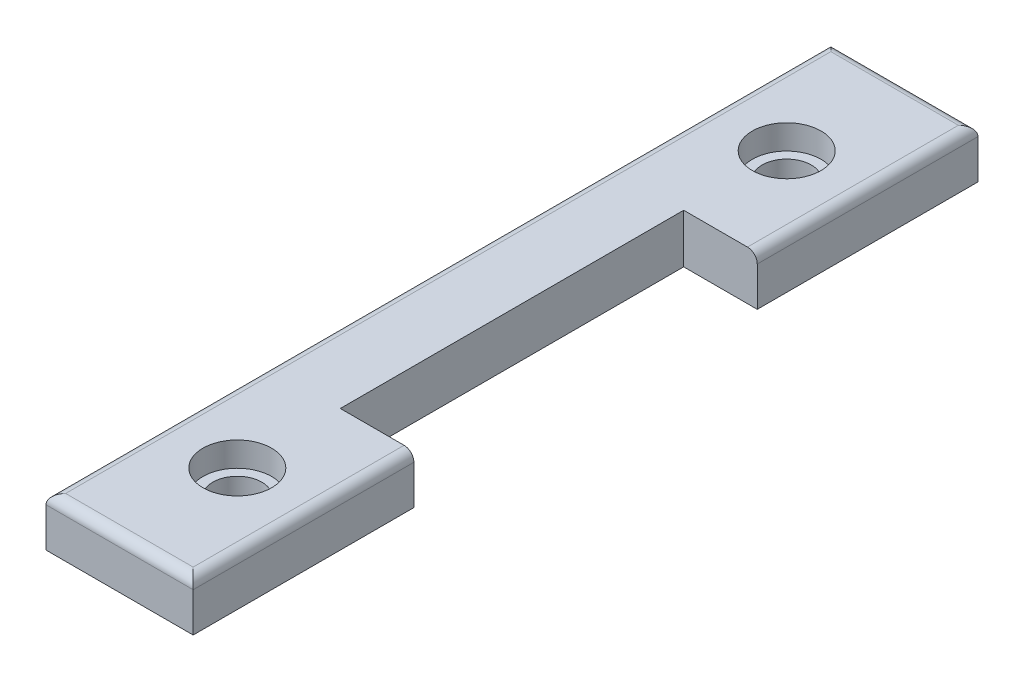
ISO-10303-21;
HEADER;
FILE_DESCRIPTION(('STEP AP214'),'2;1');
FILE_NAME('part.step','',(''),(''),'','','');
FILE_SCHEMA(('AUTOMOTIVE_DESIGN { 1 0 10303 214 1 1 1 1 }'));
ENDSEC;
DATA;
#1=APPLICATION_CONTEXT('core data for automotive mechanical design processes');
#2=APPLICATION_PROTOCOL_DEFINITION('international standard','automotive_design',2000,#1);
#3=PRODUCT_CONTEXT('',#1,'mechanical');
#4=PRODUCT('Part','Part','',(#3));
#5=PRODUCT_RELATED_PRODUCT_CATEGORY('part','',(#4));
#6=PRODUCT_DEFINITION_FORMATION('','',#4);
#7=PRODUCT_DEFINITION_CONTEXT('part definition',#1,'design');
#8=PRODUCT_DEFINITION('design','',#6,#7);
#9=PRODUCT_DEFINITION_SHAPE('','',#8);
#10=(LENGTH_UNIT() NAMED_UNIT(*) SI_UNIT(.MILLI.,.METRE.));
#11=(NAMED_UNIT(*) PLANE_ANGLE_UNIT() SI_UNIT($,.RADIAN.));
#12=(NAMED_UNIT(*) SI_UNIT($,.STERADIAN.) SOLID_ANGLE_UNIT());
#13=UNCERTAINTY_MEASURE_WITH_UNIT(LENGTH_MEASURE(1.E-05),#10,'distance_accuracy_value','');
#14=(GEOMETRIC_REPRESENTATION_CONTEXT(3) GLOBAL_UNCERTAINTY_ASSIGNED_CONTEXT((#13)) GLOBAL_UNIT_ASSIGNED_CONTEXT((#10,
#11,#12)) REPRESENTATION_CONTEXT('',''));
#15=CARTESIAN_POINT('',(0.,0.,0.));
#16=DIRECTION('',(0.,0.,1.));
#17=DIRECTION('',(1.,0.,0.));
#18=AXIS2_PLACEMENT_3D('',#15,#16,#17);
#19=CARTESIAN_POINT('',(7.5,5.,40.));
#20=DIRECTION('',(-1.,0.,0.));
#21=DIRECTION('',(0.,0.,1.));
#22=AXIS2_PLACEMENT_3D('',#19,#20,#21);
#23=PLANE('',#22);
#24=DIRECTION('',(0.,0.,-1.));
#25=VECTOR('',#24,1.);
#26=CARTESIAN_POINT('',(7.5,0.,40.));
#27=LINE('',#26,#25);
#28=CARTESIAN_POINT('',(7.5,0.,40.));
#29=VERTEX_POINT('',#28);
#30=CARTESIAN_POINT('',(7.5,0.,17.5));
#31=VERTEX_POINT('',#30);
#32=EDGE_CURVE('E145',#29,#31,#27,.T.);
#33=ORIENTED_EDGE('',*,*,#32,.T.);
#34=DIRECTION('',(0.,1.,0.));
#35=VECTOR('',#34,1.);
#36=CARTESIAN_POINT('',(7.5,0.,17.5));
#37=LINE('',#36,#35);
#38=CARTESIAN_POINT('',(7.5,4.,17.5));
#39=VERTEX_POINT('',#38);
#40=EDGE_CURVE('E191',#31,#39,#37,.T.);
#41=ORIENTED_EDGE('',*,*,#40,.T.);
#42=DIRECTION('',(0.,0.,-1.));
#43=VECTOR('',#42,1.);
#44=CARTESIAN_POINT('',(7.5,4.,40.));
#45=LINE('',#44,#43);
#46=CARTESIAN_POINT('',(7.5,4.,40.));
#47=VERTEX_POINT('',#46);
#48=EDGE_CURVE('E183',#39,#47,#45,.F.);
#49=ORIENTED_EDGE('',*,*,#48,.T.);
#50=DIRECTION('',(0.,-1.,0.));
#51=VECTOR('',#50,1.);
#52=CARTESIAN_POINT('',(7.5,5.,40.));
#53=LINE('',#52,#51);
#54=EDGE_CURVE('E161',#47,#29,#53,.T.);
#55=ORIENTED_EDGE('',*,*,#54,.T.);
#56=EDGE_LOOP('',(#33,#41,#49,#55));
#57=FACE_BOUND('',#56,.T.);
#58=ADVANCED_FACE('F37',(#57),#23,.F.);
#59=CARTESIAN_POINT('',(6.5,4.,0.));
#60=DIRECTION('',(0.,0.,-1.));
#61=DIRECTION('',(-1.,0.,0.));
#62=AXIS2_PLACEMENT_3D('',#59,#60,#61);
#63=CYLINDRICAL_SURFACE('',#62,1.);
#64=CARTESIAN_POINT('',(6.5,4.,17.5));
#65=DIRECTION('',(0.,0.,1.));
#66=DIRECTION('',(1.,0.,0.));
#67=AXIS2_PLACEMENT_3D('',#64,#65,#66);
#68=CIRCLE('',#67,1.);
#69=CARTESIAN_POINT('',(6.5,5.,17.5));
#70=VERTEX_POINT('',#69);
#71=EDGE_CURVE('E11',#70,#39,#68,.F.);
#72=ORIENTED_EDGE('',*,*,#71,.F.);
#73=DIRECTION('',(0.,0.,-1.));
#74=VECTOR('',#73,1.);
#75=CARTESIAN_POINT('',(6.5,5.,0.));
#76=LINE('',#75,#74);
#77=CARTESIAN_POINT('',(6.5,5.,39.));
#78=VERTEX_POINT('',#77);
#79=EDGE_CURVE('E174',#78,#70,#76,.T.);
#80=ORIENTED_EDGE('',*,*,#79,.F.);
#81=CARTESIAN_POINT('',(6.5,4.,39.));
#82=DIRECTION('',(0.707106781186547,0.,-0.707106781186547));
#83=DIRECTION('',(-0.707106781186547,0.,-0.707106781186547));
#84=AXIS2_PLACEMENT_3D('',#81,#82,#83);
#85=ELLIPSE('',#84,1.41421356237309,1.);
#86=EDGE_CURVE('E188',#47,#78,#85,.F.);
#87=ORIENTED_EDGE('',*,*,#86,.F.);
#88=ORIENTED_EDGE('',*,*,#48,.F.);
#89=EDGE_LOOP('',(#72,#80,#87,#88));
#90=FACE_BOUND('',#89,.T.);
#91=ADVANCED_FACE('F231',(#90),#63,.T.);
#92=CARTESIAN_POINT('',(7.5,4.,-40.));
#93=VERTEX_POINT('',#92);
#94=CARTESIAN_POINT('',(7.5,4.,-17.5));
#95=VERTEX_POINT('',#94);
#96=EDGE_CURVE('E136',#93,#95,#45,.F.);
#97=ORIENTED_EDGE('',*,*,#96,.T.);
#98=DIRECTION('',(0.,1.,0.));
#99=VECTOR('',#98,1.);
#100=CARTESIAN_POINT('',(7.5,0.,-17.5));
#101=LINE('',#100,#99);
#102=CARTESIAN_POINT('',(7.5,0.,-17.5));
#103=VERTEX_POINT('',#102);
#104=EDGE_CURVE('E52',#103,#95,#101,.T.);
#105=ORIENTED_EDGE('',*,*,#104,.F.);
#106=CARTESIAN_POINT('',(7.5,0.,-40.));
#107=VERTEX_POINT('',#106);
#108=EDGE_CURVE('E133',#103,#107,#27,.T.);
#109=ORIENTED_EDGE('',*,*,#108,.T.);
#110=DIRECTION('',(0.,-1.,0.));
#111=VECTOR('',#110,1.);
#112=CARTESIAN_POINT('',(7.5,5.,-40.));
#113=LINE('',#112,#111);
#114=EDGE_CURVE('E167',#93,#107,#113,.T.);
#115=ORIENTED_EDGE('',*,*,#114,.F.);
#116=EDGE_LOOP('',(#97,#105,#109,#115));
#117=FACE_BOUND('',#116,.T.);
#118=ADVANCED_FACE('F131',(#117),#23,.F.);
#119=CARTESIAN_POINT('',(-7.5,5.,-40.));
#120=DIRECTION('',(0.,0.,1.));
#121=DIRECTION('',(1.,0.,0.));
#122=AXIS2_PLACEMENT_3D('',#119,#120,#121);
#123=PLANE('',#122);
#124=DIRECTION('',(0.,-1.,0.));
#125=VECTOR('',#124,1.);
#126=CARTESIAN_POINT('',(-7.5,5.,-40.));
#127=LINE('',#126,#125);
#128=CARTESIAN_POINT('',(-7.5,4.,-40.));
#129=VERTEX_POINT('',#128);
#130=CARTESIAN_POINT('',(-7.5,0.,-40.));
#131=VERTEX_POINT('',#130);
#132=EDGE_CURVE('E165',#129,#131,#127,.T.);
#133=ORIENTED_EDGE('',*,*,#132,.F.);
#134=DIRECTION('',(-1.,0.,0.));
#135=VECTOR('',#134,1.);
#136=CARTESIAN_POINT('',(-7.5,4.,-40.));
#137=LINE('',#136,#135);
#138=EDGE_CURVE('E186',#129,#93,#137,.F.);
#139=ORIENTED_EDGE('',*,*,#138,.T.);
#140=ORIENTED_EDGE('',*,*,#114,.T.);
#141=DIRECTION('',(-1.,0.,0.));
#142=VECTOR('',#141,1.);
#143=CARTESIAN_POINT('',(-7.5,0.,-40.));
#144=LINE('',#143,#142);
#145=EDGE_CURVE('E144',#107,#131,#144,.T.);
#146=ORIENTED_EDGE('',*,*,#145,.T.);
#147=EDGE_LOOP('',(#133,#139,#140,#146));
#148=FACE_BOUND('',#147,.T.);
#149=ADVANCED_FACE('F273',(#148),#123,.F.);
#150=CARTESIAN_POINT('',(-7.5,5.,40.));
#151=DIRECTION('',(1.,0.,0.));
#152=DIRECTION('',(0.,0.,-1.));
#153=AXIS2_PLACEMENT_3D('',#150,#151,#152);
#154=PLANE('',#153);
#155=DIRECTION('',(0.,-1.,0.));
#156=VECTOR('',#155,1.);
#157=CARTESIAN_POINT('',(-7.5,5.,40.));
#158=LINE('',#157,#156);
#159=CARTESIAN_POINT('',(-7.5,4.,40.));
#160=VERTEX_POINT('',#159);
#161=CARTESIAN_POINT('',(-7.5,0.,40.));
#162=VERTEX_POINT('',#161);
#163=EDGE_CURVE('E163',#160,#162,#158,.T.);
#164=ORIENTED_EDGE('',*,*,#163,.F.);
#165=DIRECTION('',(0.,0.,1.));
#166=VECTOR('',#165,1.);
#167=CARTESIAN_POINT('',(-7.5,4.,40.));
#168=LINE('',#167,#166);
#169=EDGE_CURVE('E60',#160,#129,#168,.F.);
#170=ORIENTED_EDGE('',*,*,#169,.T.);
#171=ORIENTED_EDGE('',*,*,#132,.T.);
#172=DIRECTION('',(0.,0.,1.));
#173=VECTOR('',#172,1.);
#174=CARTESIAN_POINT('',(-7.5,0.,40.));
#175=LINE('',#174,#173);
#176=EDGE_CURVE('E155',#131,#162,#175,.T.);
#177=ORIENTED_EDGE('',*,*,#176,.T.);
#178=EDGE_LOOP('',(#164,#170,#171,#177));
#179=FACE_BOUND('',#178,.T.);
#180=ADVANCED_FACE('F277',(#179),#154,.F.);
#181=CARTESIAN_POINT('',(-7.5,5.,40.));
#182=DIRECTION('',(0.,0.,-1.));
#183=DIRECTION('',(-1.,0.,0.));
#184=AXIS2_PLACEMENT_3D('',#181,#182,#183);
#185=PLANE('',#184);
#186=ORIENTED_EDGE('',*,*,#54,.F.);
#187=DIRECTION('',(1.,0.,0.));
#188=VECTOR('',#187,1.);
#189=CARTESIAN_POINT('',(-7.5,4.,40.));
#190=LINE('',#189,#188);
#191=EDGE_CURVE('E180',#47,#160,#190,.F.);
#192=ORIENTED_EDGE('',*,*,#191,.T.);
#193=ORIENTED_EDGE('',*,*,#163,.T.);
#194=DIRECTION('',(1.,0.,0.));
#195=VECTOR('',#194,1.);
#196=CARTESIAN_POINT('',(-7.5,0.,40.));
#197=LINE('',#196,#195);
#198=EDGE_CURVE('E158',#162,#29,#197,.T.);
#199=ORIENTED_EDGE('',*,*,#198,.T.);
#200=EDGE_LOOP('',(#186,#192,#193,#199));
#201=FACE_BOUND('',#200,.T.);
#202=ADVANCED_FACE('F282',(#201),#185,.F.);
#203=CARTESIAN_POINT('',(0.,5.,0.));
#204=DIRECTION('',(0.,-1.,0.));
#205=DIRECTION('',(0.,0.,-1.));
#206=AXIS2_PLACEMENT_3D('',#203,#204,#205);
#207=PLANE('',#206);
#208=ORIENTED_EDGE('',*,*,#79,.T.);
#209=DIRECTION('',(1.,0.,0.));
#210=VECTOR('',#209,1.);
#211=CARTESIAN_POINT('',(0.,5.,17.5));
#212=LINE('',#211,#210);
#213=CARTESIAN_POINT('',(0.,5.,17.5));
#214=VERTEX_POINT('',#213);
#215=EDGE_CURVE('E127',#214,#70,#212,.T.);
#216=ORIENTED_EDGE('',*,*,#215,.F.);
#217=DIRECTION('',(0.,0.,1.));
#218=VECTOR('',#217,1.);
#219=CARTESIAN_POINT('',(0.,5.,-17.5));
#220=LINE('',#219,#218);
#221=CARTESIAN_POINT('',(0.,5.,-17.5));
#222=VERTEX_POINT('',#221);
#223=EDGE_CURVE('E210',#222,#214,#220,.T.);
#224=ORIENTED_EDGE('',*,*,#223,.F.);
#225=DIRECTION('',(-1.,0.,0.));
#226=VECTOR('',#225,1.);
#227=CARTESIAN_POINT('',(0.,5.,-17.5));
#228=LINE('',#227,#226);
#229=CARTESIAN_POINT('',(6.5,5.,-17.5));
#230=VERTEX_POINT('',#229);
#231=EDGE_CURVE('E200',#230,#222,#228,.T.);
#232=ORIENTED_EDGE('',*,*,#231,.F.);
#233=CARTESIAN_POINT('',(6.5,5.,-39.));
#234=VERTEX_POINT('',#233);
#235=EDGE_CURVE('E173',#230,#234,#76,.T.);
#236=ORIENTED_EDGE('',*,*,#235,.T.);
#237=DIRECTION('',(-1.,0.,0.));
#238=VECTOR('',#237,1.);
#239=CARTESIAN_POINT('',(0.,5.,-39.));
#240=LINE('',#239,#238);
#241=CARTESIAN_POINT('',(-6.5,5.,-39.));
#242=VERTEX_POINT('',#241);
#243=EDGE_CURVE('E169',#234,#242,#240,.T.);
#244=ORIENTED_EDGE('',*,*,#243,.T.);
#245=DIRECTION('',(0.,0.,1.));
#246=VECTOR('',#245,1.);
#247=CARTESIAN_POINT('',(-6.5,5.,0.));
#248=LINE('',#247,#246);
#249=CARTESIAN_POINT('',(-6.5,5.,39.));
#250=VERTEX_POINT('',#249);
#251=EDGE_CURVE('E171',#242,#250,#248,.T.);
#252=ORIENTED_EDGE('',*,*,#251,.T.);
#253=DIRECTION('',(1.,0.,0.));
#254=VECTOR('',#253,1.);
#255=CARTESIAN_POINT('',(0.,5.,39.));
#256=LINE('',#255,#254);
#257=EDGE_CURVE('E177',#250,#78,#256,.T.);
#258=ORIENTED_EDGE('',*,*,#257,.T.);
#259=EDGE_LOOP('',(#208,#216,#224,#232,#236,#244,#252,#258));
#260=FACE_BOUND('',#259,.T.);
#261=CARTESIAN_POINT('',(0.,5.,-28.));
#262=DIRECTION('',(0.,-1.,0.));
#263=DIRECTION('',(0.,0.,-1.));
#264=AXIS2_PLACEMENT_3D('',#261,#262,#263);
#265=CIRCLE('',#264,3.5);
#266=CARTESIAN_POINT('',(0.,5.,-31.5));
#267=VERTEX_POINT('',#266);
#268=EDGE_CURVE('E198',#267,#267,#265,.T.);
#269=ORIENTED_EDGE('',*,*,#268,.T.);
#270=EDGE_LOOP('',(#269));
#271=FACE_BOUND('',#270,.T.);
#272=CARTESIAN_POINT('',(0.,5.,28.));
#273=DIRECTION('',(0.,1.,0.));
#274=DIRECTION('',(0.,0.,1.));
#275=AXIS2_PLACEMENT_3D('',#272,#273,#274);
#276=CIRCLE('',#275,3.5);
#277=CARTESIAN_POINT('',(0.,5.,31.5));
#278=VERTEX_POINT('',#277);
#279=EDGE_CURVE('E150',#278,#278,#276,.T.);
#280=ORIENTED_EDGE('',*,*,#279,.F.);
#281=EDGE_LOOP('',(#280));
#282=FACE_BOUND('',#281,.T.);
#283=ADVANCED_FACE('F205',(#260,#271,#282),#207,.F.);
#284=CARTESIAN_POINT('',(0.,0.,0.));
#285=DIRECTION('',(0.,-1.,0.));
#286=DIRECTION('',(0.,0.,-1.));
#287=AXIS2_PLACEMENT_3D('',#284,#285,#286);
#288=PLANE('',#287);
#289=CARTESIAN_POINT('',(0.,0.,-28.));
#290=DIRECTION('',(0.,1.,0.));
#291=DIRECTION('',(0.,0.,1.));
#292=AXIS2_PLACEMENT_3D('',#289,#290,#291);
#293=CIRCLE('',#292,2.5);
#294=CARTESIAN_POINT('',(0.,0.,-25.5));
#295=VERTEX_POINT('',#294);
#296=EDGE_CURVE('E211',#295,#295,#293,.T.);
#297=ORIENTED_EDGE('',*,*,#296,.T.);
#298=EDGE_LOOP('',(#297));
#299=FACE_BOUND('',#298,.T.);
#300=CARTESIAN_POINT('',(0.,0.,28.));
#301=DIRECTION('',(0.,1.,0.));
#302=DIRECTION('',(0.,0.,1.));
#303=AXIS2_PLACEMENT_3D('',#300,#301,#302);
#304=CIRCLE('',#303,2.5);
#305=CARTESIAN_POINT('',(0.,0.,30.5));
#306=VERTEX_POINT('',#305);
#307=EDGE_CURVE('E488',#306,#306,#304,.T.);
#308=ORIENTED_EDGE('',*,*,#307,.T.);
#309=EDGE_LOOP('',(#308));
#310=FACE_BOUND('',#309,.T.);
#311=DIRECTION('',(1.,0.,0.));
#312=VECTOR('',#311,1.);
#313=CARTESIAN_POINT('',(0.,0.,17.5));
#314=LINE('',#313,#312);
#315=CARTESIAN_POINT('',(0.,0.,17.5));
#316=VERTEX_POINT('',#315);
#317=EDGE_CURVE('E137',#316,#31,#314,.T.);
#318=ORIENTED_EDGE('',*,*,#317,.T.);
#319=ORIENTED_EDGE('',*,*,#32,.F.);
#320=ORIENTED_EDGE('',*,*,#198,.F.);
#321=ORIENTED_EDGE('',*,*,#176,.F.);
#322=ORIENTED_EDGE('',*,*,#145,.F.);
#323=ORIENTED_EDGE('',*,*,#108,.F.);
#324=DIRECTION('',(-1.,0.,0.));
#325=VECTOR('',#324,1.);
#326=CARTESIAN_POINT('',(0.,0.,-17.5));
#327=LINE('',#326,#325);
#328=CARTESIAN_POINT('',(0.,0.,-17.5));
#329=VERTEX_POINT('',#328);
#330=EDGE_CURVE('E118',#103,#329,#327,.T.);
#331=ORIENTED_EDGE('',*,*,#330,.T.);
#332=DIRECTION('',(0.,0.,1.));
#333=VECTOR('',#332,1.);
#334=CARTESIAN_POINT('',(0.,0.,-17.5));
#335=LINE('',#334,#333);
#336=EDGE_CURVE('E126',#329,#316,#335,.T.);
#337=ORIENTED_EDGE('',*,*,#336,.T.);
#338=EDGE_LOOP('',(#318,#319,#320,#321,#322,#323,#331,#337));
#339=FACE_BOUND('',#338,.T.);
#340=ADVANCED_FACE('F141',(#299,#310,#339),#288,.T.);
#341=CARTESIAN_POINT('',(0.,2.5,28.));
#342=DIRECTION('',(0.,1.,0.));
#343=DIRECTION('',(0.,0.,1.));
#344=AXIS2_PLACEMENT_3D('',#341,#342,#343);
#345=CYLINDRICAL_SURFACE('',#344,3.5);
#346=CARTESIAN_POINT('',(0.,2.5,28.));
#347=DIRECTION('',(0.,1.,0.));
#348=DIRECTION('',(0.,0.,1.));
#349=AXIS2_PLACEMENT_3D('',#346,#347,#348);
#350=CIRCLE('',#349,3.5);
#351=CARTESIAN_POINT('',(0.,2.5,31.5));
#352=VERTEX_POINT('',#351);
#353=EDGE_CURVE('E146',#352,#352,#350,.T.);
#354=ORIENTED_EDGE('',*,*,#353,.F.);
#355=EDGE_LOOP('',(#354));
#356=FACE_BOUND('',#355,.T.);
#357=ORIENTED_EDGE('',*,*,#279,.T.);
#358=EDGE_LOOP('',(#357));
#359=FACE_BOUND('',#358,.T.);
#360=ADVANCED_FACE('F260',(#356,#359),#345,.F.);
#361=CARTESIAN_POINT('',(0.,2.5,28.));
#362=DIRECTION('',(0.,1.,0.));
#363=DIRECTION('',(0.,0.,1.));
#364=AXIS2_PLACEMENT_3D('',#361,#362,#363);
#365=PLANE('',#364);
#366=CARTESIAN_POINT('',(0.,2.5,28.));
#367=DIRECTION('',(0.,1.,0.));
#368=DIRECTION('',(0.,0.,1.));
#369=AXIS2_PLACEMENT_3D('',#366,#367,#368);
#370=CIRCLE('',#369,2.5);
#371=CARTESIAN_POINT('',(0.,2.5,30.5));
#372=VERTEX_POINT('',#371);
#373=EDGE_CURVE('E491',#372,#372,#370,.T.);
#374=ORIENTED_EDGE('',*,*,#373,.F.);
#375=EDGE_LOOP('',(#374));
#376=FACE_BOUND('',#375,.T.);
#377=ORIENTED_EDGE('',*,*,#353,.T.);
#378=EDGE_LOOP('',(#377));
#379=FACE_BOUND('',#378,.T.);
#380=ADVANCED_FACE('F251',(#376,#379),#365,.T.);
#381=CARTESIAN_POINT('',(0.,2.5,-28.));
#382=DIRECTION('',(0.,1.,0.));
#383=DIRECTION('',(0.,0.,1.));
#384=AXIS2_PLACEMENT_3D('',#381,#382,#383);
#385=CYLINDRICAL_SURFACE('',#384,3.5);
#386=CARTESIAN_POINT('',(0.,2.5,-28.));
#387=DIRECTION('',(0.,-1.,0.));
#388=DIRECTION('',(0.,0.,-1.));
#389=AXIS2_PLACEMENT_3D('',#386,#387,#388);
#390=CIRCLE('',#389,3.5);
#391=CARTESIAN_POINT('',(0.,2.5,-31.5));
#392=VERTEX_POINT('',#391);
#393=EDGE_CURVE('E241',#392,#392,#390,.T.);
#394=ORIENTED_EDGE('',*,*,#393,.T.);
#395=EDGE_LOOP('',(#394));
#396=FACE_BOUND('',#395,.T.);
#397=ORIENTED_EDGE('',*,*,#268,.F.);
#398=EDGE_LOOP('',(#397));
#399=FACE_BOUND('',#398,.T.);
#400=ADVANCED_FACE('F248',(#396,#399),#385,.F.);
#401=CARTESIAN_POINT('',(0.,2.5,-28.));
#402=DIRECTION('',(0.,1.,0.));
#403=DIRECTION('',(0.,0.,-1.));
#404=AXIS2_PLACEMENT_3D('',#401,#402,#403);
#405=PLANE('',#404);
#406=CARTESIAN_POINT('',(0.,2.5,-28.));
#407=DIRECTION('',(0.,1.,0.));
#408=DIRECTION('',(0.,0.,1.));
#409=AXIS2_PLACEMENT_3D('',#406,#407,#408);
#410=CIRCLE('',#409,2.5);
#411=CARTESIAN_POINT('',(0.,2.5,-25.5));
#412=VERTEX_POINT('',#411);
#413=EDGE_CURVE('E494',#412,#412,#410,.T.);
#414=ORIENTED_EDGE('',*,*,#413,.F.);
#415=EDGE_LOOP('',(#414));
#416=FACE_BOUND('',#415,.T.);
#417=ORIENTED_EDGE('',*,*,#393,.F.);
#418=EDGE_LOOP('',(#417));
#419=FACE_BOUND('',#418,.T.);
#420=ADVANCED_FACE('F250',(#416,#419),#405,.T.);
#421=CARTESIAN_POINT('',(0.,4.,-39.));
#422=DIRECTION('',(-1.,0.,0.));
#423=DIRECTION('',(0.,0.,1.));
#424=AXIS2_PLACEMENT_3D('',#421,#422,#423);
#425=CYLINDRICAL_SURFACE('',#424,1.);
#426=CARTESIAN_POINT('',(6.5,4.,-39.));
#427=DIRECTION('',(-0.707106781186547,0.,-0.707106781186547));
#428=DIRECTION('',(-0.707106781186547,0.,0.707106781186547));
#429=AXIS2_PLACEMENT_3D('',#426,#427,#428);
#430=ELLIPSE('',#429,1.41421356237309,1.);
#431=EDGE_CURVE('E193',#93,#234,#430,.F.);
#432=ORIENTED_EDGE('',*,*,#431,.F.);
#433=ORIENTED_EDGE('',*,*,#138,.F.);
#434=CARTESIAN_POINT('',(-6.5,4.,-39.));
#435=DIRECTION('',(-0.707106781186547,0.,0.707106781186547));
#436=DIRECTION('',(-0.707106781186547,0.,-0.707106781186547));
#437=AXIS2_PLACEMENT_3D('',#434,#435,#436);
#438=ELLIPSE('',#437,1.41421356237309,1.);
#439=EDGE_CURVE('E196',#242,#129,#438,.T.);
#440=ORIENTED_EDGE('',*,*,#439,.F.);
#441=ORIENTED_EDGE('',*,*,#243,.F.);
#442=EDGE_LOOP('',(#432,#433,#440,#441));
#443=FACE_BOUND('',#442,.T.);
#444=ADVANCED_FACE('F39',(#443),#425,.T.);
#445=CARTESIAN_POINT('',(-6.5,4.,0.));
#446=DIRECTION('',(0.,0.,1.));
#447=DIRECTION('',(1.,0.,0.));
#448=AXIS2_PLACEMENT_3D('',#445,#446,#447);
#449=CYLINDRICAL_SURFACE('',#448,1.);
#450=ORIENTED_EDGE('',*,*,#439,.T.);
#451=ORIENTED_EDGE('',*,*,#169,.F.);
#452=CARTESIAN_POINT('',(-6.5,4.,39.));
#453=DIRECTION('',(0.707106781186547,0.,0.707106781186547));
#454=DIRECTION('',(-0.707106781186547,0.,0.707106781186547));
#455=AXIS2_PLACEMENT_3D('',#452,#453,#454);
#456=ELLIPSE('',#455,1.41421356237309,1.);
#457=EDGE_CURVE('E190',#250,#160,#456,.T.);
#458=ORIENTED_EDGE('',*,*,#457,.F.);
#459=ORIENTED_EDGE('',*,*,#251,.F.);
#460=EDGE_LOOP('',(#450,#451,#458,#459));
#461=FACE_BOUND('',#460,.T.);
#462=ADVANCED_FACE('F222',(#461),#449,.T.);
#463=CARTESIAN_POINT('',(6.5,4.,-17.5));
#464=DIRECTION('',(0.,0.,-1.));
#465=DIRECTION('',(-1.,0.,0.));
#466=AXIS2_PLACEMENT_3D('',#463,#464,#465);
#467=CIRCLE('',#466,1.);
#468=EDGE_CURVE('E45',#95,#230,#467,.F.);
#469=ORIENTED_EDGE('',*,*,#468,.F.);
#470=ORIENTED_EDGE('',*,*,#96,.F.);
#471=ORIENTED_EDGE('',*,*,#431,.T.);
#472=ORIENTED_EDGE('',*,*,#235,.F.);
#473=EDGE_LOOP('',(#469,#470,#471,#472));
#474=FACE_BOUND('',#473,.T.);
#475=ADVANCED_FACE('F213',(#474),#63,.T.);
#476=CARTESIAN_POINT('',(0.,4.,39.));
#477=DIRECTION('',(1.,0.,0.));
#478=DIRECTION('',(0.,0.,-1.));
#479=AXIS2_PLACEMENT_3D('',#476,#477,#478);
#480=CYLINDRICAL_SURFACE('',#479,1.);
#481=ORIENTED_EDGE('',*,*,#457,.T.);
#482=ORIENTED_EDGE('',*,*,#191,.F.);
#483=ORIENTED_EDGE('',*,*,#86,.T.);
#484=ORIENTED_EDGE('',*,*,#257,.F.);
#485=EDGE_LOOP('',(#481,#482,#483,#484));
#486=FACE_BOUND('',#485,.T.);
#487=ADVANCED_FACE('F225',(#486),#480,.T.);
#488=CARTESIAN_POINT('',(0.,0.,17.5));
#489=DIRECTION('',(0.,0.,1.));
#490=DIRECTION('',(1.,0.,0.));
#491=AXIS2_PLACEMENT_3D('',#488,#489,#490);
#492=PLANE('',#491);
#493=ORIENTED_EDGE('',*,*,#71,.T.);
#494=ORIENTED_EDGE('',*,*,#40,.F.);
#495=ORIENTED_EDGE('',*,*,#317,.F.);
#496=DIRECTION('',(0.,1.,0.));
#497=VECTOR('',#496,1.);
#498=CARTESIAN_POINT('',(0.,0.,17.5));
#499=LINE('',#498,#497);
#500=EDGE_CURVE('E238',#316,#214,#499,.T.);
#501=ORIENTED_EDGE('',*,*,#500,.T.);
#502=ORIENTED_EDGE('',*,*,#215,.T.);
#503=EDGE_LOOP('',(#493,#494,#495,#501,#502));
#504=FACE_BOUND('',#503,.T.);
#505=ADVANCED_FACE('F363',(#504),#492,.F.);
#506=CARTESIAN_POINT('',(0.,0.,-17.5));
#507=DIRECTION('',(-1.,0.,0.));
#508=DIRECTION('',(0.,0.,1.));
#509=AXIS2_PLACEMENT_3D('',#506,#507,#508);
#510=PLANE('',#509);
#511=ORIENTED_EDGE('',*,*,#223,.T.);
#512=ORIENTED_EDGE('',*,*,#500,.F.);
#513=ORIENTED_EDGE('',*,*,#336,.F.);
#514=DIRECTION('',(0.,1.,0.));
#515=VECTOR('',#514,1.);
#516=CARTESIAN_POINT('',(0.,0.,-17.5));
#517=LINE('',#516,#515);
#518=EDGE_CURVE('E121',#329,#222,#517,.T.);
#519=ORIENTED_EDGE('',*,*,#518,.T.);
#520=EDGE_LOOP('',(#511,#512,#513,#519));
#521=FACE_BOUND('',#520,.T.);
#522=ADVANCED_FACE('F355',(#521),#510,.F.);
#523=CARTESIAN_POINT('',(0.,0.,-17.5));
#524=DIRECTION('',(0.,0.,-1.));
#525=DIRECTION('',(-1.,0.,0.));
#526=AXIS2_PLACEMENT_3D('',#523,#524,#525);
#527=PLANE('',#526);
#528=ORIENTED_EDGE('',*,*,#468,.T.);
#529=ORIENTED_EDGE('',*,*,#231,.T.);
#530=ORIENTED_EDGE('',*,*,#518,.F.);
#531=ORIENTED_EDGE('',*,*,#330,.F.);
#532=ORIENTED_EDGE('',*,*,#104,.T.);
#533=EDGE_LOOP('',(#528,#529,#530,#531,#532));
#534=FACE_BOUND('',#533,.T.);
#535=ADVANCED_FACE('F119',(#534),#527,.F.);
#536=CARTESIAN_POINT('',(0.,0.,28.));
#537=DIRECTION('',(0.,1.,0.));
#538=DIRECTION('',(0.,0.,1.));
#539=AXIS2_PLACEMENT_3D('',#536,#537,#538);
#540=CYLINDRICAL_SURFACE('',#539,2.5);
#541=ORIENTED_EDGE('',*,*,#307,.F.);
#542=EDGE_LOOP('',(#541));
#543=FACE_BOUND('',#542,.T.);
#544=ORIENTED_EDGE('',*,*,#373,.T.);
#545=EDGE_LOOP('',(#544));
#546=FACE_BOUND('',#545,.T.);
#547=ADVANCED_FACE('F327',(#543,#546),#540,.F.);
#548=CARTESIAN_POINT('',(0.,0.,-28.));
#549=DIRECTION('',(0.,1.,0.));
#550=DIRECTION('',(0.,0.,1.));
#551=AXIS2_PLACEMENT_3D('',#548,#549,#550);
#552=CYLINDRICAL_SURFACE('',#551,2.5);
#553=ORIENTED_EDGE('',*,*,#296,.F.);
#554=EDGE_LOOP('',(#553));
#555=FACE_BOUND('',#554,.T.);
#556=ORIENTED_EDGE('',*,*,#413,.T.);
#557=EDGE_LOOP('',(#556));
#558=FACE_BOUND('',#557,.T.);
#559=ADVANCED_FACE('F332',(#555,#558),#552,.F.);
#560=CLOSED_SHELL('',(#58,#91,#118,#149,#180,#202,#283,#340,#360,#380,#400,#420,#444,#462,#475,
#487,#505,#522,#535,#547,#559));
#561=MANIFOLD_SOLID_BREP('B2',#560);
#562=ADVANCED_BREP_SHAPE_REPRESENTATION('',(#18,#561),#14);
#563=SHAPE_DEFINITION_REPRESENTATION(#9,#562);
ENDSEC;
END-ISO-10303-21;
